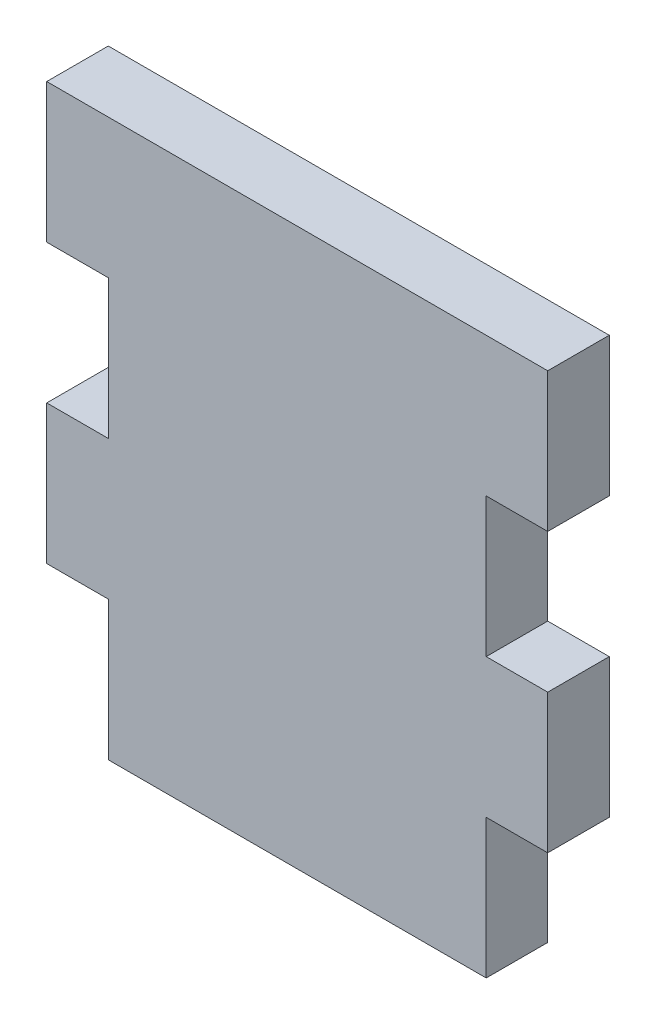
ISO-10303-21;
HEADER;
FILE_DESCRIPTION(('STEP AP214'),'2;1');
FILE_NAME('part.step','',(''),(''),'','','');
FILE_SCHEMA(('AUTOMOTIVE_DESIGN { 1 0 10303 214 1 1 1 1 }'));
ENDSEC;
DATA;
#1=APPLICATION_CONTEXT('core data for automotive mechanical design processes');
#2=APPLICATION_PROTOCOL_DEFINITION('international standard','automotive_design',2000,#1);
#3=PRODUCT_CONTEXT('',#1,'mechanical');
#4=PRODUCT('Part','Part','',(#3));
#5=PRODUCT_RELATED_PRODUCT_CATEGORY('part','',(#4));
#6=PRODUCT_DEFINITION_FORMATION('','',#4);
#7=PRODUCT_DEFINITION_CONTEXT('part definition',#1,'design');
#8=PRODUCT_DEFINITION('design','',#6,#7);
#9=PRODUCT_DEFINITION_SHAPE('','',#8);
#10=(LENGTH_UNIT() NAMED_UNIT(*) SI_UNIT(.MILLI.,.METRE.));
#11=(NAMED_UNIT(*) PLANE_ANGLE_UNIT() SI_UNIT($,.RADIAN.));
#12=(NAMED_UNIT(*) SI_UNIT($,.STERADIAN.) SOLID_ANGLE_UNIT());
#13=UNCERTAINTY_MEASURE_WITH_UNIT(LENGTH_MEASURE(1.E-05),#10,'distance_accuracy_value','');
#14=(GEOMETRIC_REPRESENTATION_CONTEXT(3) GLOBAL_UNCERTAINTY_ASSIGNED_CONTEXT((#13)) GLOBAL_UNIT_ASSIGNED_CONTEXT((#10,
#11,#12)) REPRESENTATION_CONTEXT('',''));
#15=CARTESIAN_POINT('',(0.,0.,0.));
#16=DIRECTION('',(0.,0.,1.));
#17=DIRECTION('',(1.,0.,0.));
#18=AXIS2_PLACEMENT_3D('',#15,#16,#17);
#19=CARTESIAN_POINT('',(-44.6512493245253,14.1108572179902,5.334));
#20=DIRECTION('',(-1.,0.,0.));
#21=DIRECTION('',(0.,-1.,0.));
#22=AXIS2_PLACEMENT_3D('',#19,#20,#21);
#23=PLANE('',#22);
#24=DIRECTION('',(0.,1.,0.));
#25=VECTOR('',#24,1.);
#26=CARTESIAN_POINT('',(-44.6512493245253,14.1108572179902,5.334));
#27=LINE('',#26,#25);
#28=CARTESIAN_POINT('',(-44.6512493245253,-22.0841427820098,5.334));
#29=VERTEX_POINT('',#28);
#30=CARTESIAN_POINT('',(-44.6512493245253,-10.0191427820098,5.334));
#31=VERTEX_POINT('',#30);
#32=EDGE_CURVE('E253',#29,#31,#27,.T.);
#33=ORIENTED_EDGE('',*,*,#32,.F.);
#34=DIRECTION('',(0.,0.,1.));
#35=VECTOR('',#34,1.);
#36=CARTESIAN_POINT('',(-44.6512493245253,-22.0841427820098,0.));
#37=LINE('',#36,#35);
#38=CARTESIAN_POINT('',(-44.6512493245253,-22.0841427820098,0.));
#39=VERTEX_POINT('',#38);
#40=EDGE_CURVE('E172',#39,#29,#37,.T.);
#41=ORIENTED_EDGE('',*,*,#40,.F.);
#42=DIRECTION('',(0.,1.,0.));
#43=VECTOR('',#42,1.);
#44=CARTESIAN_POINT('',(-44.6512493245253,14.1108572179902,0.));
#45=LINE('',#44,#43);
#46=CARTESIAN_POINT('',(-44.6512493245253,-10.0191427820098,0.));
#47=VERTEX_POINT('',#46);
#48=EDGE_CURVE('E166',#39,#47,#45,.T.);
#49=ORIENTED_EDGE('',*,*,#48,.T.);
#50=DIRECTION('',(0.,0.,1.));
#51=VECTOR('',#50,1.);
#52=CARTESIAN_POINT('',(-44.6512493245253,-10.0191427820098,0.));
#53=LINE('',#52,#51);
#54=EDGE_CURVE('E183',#47,#31,#53,.T.);
#55=ORIENTED_EDGE('',*,*,#54,.T.);
#56=EDGE_LOOP('',(#33,#41,#49,#55));
#57=FACE_BOUND('',#56,.T.);
#58=ADVANCED_FACE('F35',(#57),#23,.F.);
#59=CARTESIAN_POINT('',(-88.0852493245253,14.1108572179902,5.334));
#60=DIRECTION('',(1.,0.,0.));
#61=DIRECTION('',(0.,0.,-1.));
#62=AXIS2_PLACEMENT_3D('',#59,#60,#61);
#63=PLANE('',#62);
#64=DIRECTION('',(0.,-1.,0.));
#65=VECTOR('',#64,1.);
#66=CARTESIAN_POINT('',(-88.0852493245253,14.1108572179902,0.));
#67=LINE('',#66,#65);
#68=CARTESIAN_POINT('',(-88.0852493245253,14.1108572179902,0.));
#69=VERTEX_POINT('',#68);
#70=CARTESIAN_POINT('',(-88.0852493245253,2.04585721799016,0.));
#71=VERTEX_POINT('',#70);
#72=EDGE_CURVE('E257',#69,#71,#67,.T.);
#73=ORIENTED_EDGE('',*,*,#72,.T.);
#74=DIRECTION('',(0.,0.,1.));
#75=VECTOR('',#74,1.);
#76=CARTESIAN_POINT('',(-88.0852493245253,2.04585721799016,0.));
#77=LINE('',#76,#75);
#78=CARTESIAN_POINT('',(-88.0852493245253,2.04585721799016,5.334));
#79=VERTEX_POINT('',#78);
#80=EDGE_CURVE('E217',#71,#79,#77,.T.);
#81=ORIENTED_EDGE('',*,*,#80,.T.);
#82=DIRECTION('',(0.,-1.,0.));
#83=VECTOR('',#82,1.);
#84=CARTESIAN_POINT('',(-88.0852493245253,14.1108572179902,5.334));
#85=LINE('',#84,#83);
#86=CARTESIAN_POINT('',(-88.0852493245253,14.1108572179902,5.334));
#87=VERTEX_POINT('',#86);
#88=EDGE_CURVE('E245',#87,#79,#85,.T.);
#89=ORIENTED_EDGE('',*,*,#88,.F.);
#90=DIRECTION('',(0.,0.,-1.));
#91=VECTOR('',#90,1.);
#92=CARTESIAN_POINT('',(-88.0852493245253,14.1108572179902,5.334));
#93=LINE('',#92,#91);
#94=EDGE_CURVE('E43',#87,#69,#93,.T.);
#95=ORIENTED_EDGE('',*,*,#94,.T.);
#96=EDGE_LOOP('',(#73,#81,#89,#95));
#97=FACE_BOUND('',#96,.T.);
#98=ADVANCED_FACE('F270',(#97),#63,.F.);
#99=CARTESIAN_POINT('',(-88.0852493245253,-10.0191427820098,5.334));
#100=VERTEX_POINT('',#99);
#101=CARTESIAN_POINT('',(-88.0852493245253,-22.0841427820098,5.334));
#102=VERTEX_POINT('',#101);
#103=EDGE_CURVE('E249',#100,#102,#85,.T.);
#104=ORIENTED_EDGE('',*,*,#103,.F.);
#105=DIRECTION('',(0.,0.,1.));
#106=VECTOR('',#105,1.);
#107=CARTESIAN_POINT('',(-88.0852493245253,-10.0191427820098,0.));
#108=LINE('',#107,#106);
#109=CARTESIAN_POINT('',(-88.0852493245253,-10.0191427820098,0.));
#110=VERTEX_POINT('',#109);
#111=EDGE_CURVE('E210',#110,#100,#108,.T.);
#112=ORIENTED_EDGE('',*,*,#111,.F.);
#113=CARTESIAN_POINT('',(-88.0852493245253,-22.0841427820098,0.));
#114=VERTEX_POINT('',#113);
#115=EDGE_CURVE('E241',#110,#114,#67,.T.);
#116=ORIENTED_EDGE('',*,*,#115,.T.);
#117=DIRECTION('',(0.,0.,1.));
#118=VECTOR('',#117,1.);
#119=CARTESIAN_POINT('',(-88.0852493245253,-22.0841427820098,0.));
#120=LINE('',#119,#118);
#121=EDGE_CURVE('E238',#114,#102,#120,.T.);
#122=ORIENTED_EDGE('',*,*,#121,.T.);
#123=EDGE_LOOP('',(#104,#112,#116,#122));
#124=FACE_BOUND('',#123,.T.);
#125=ADVANCED_FACE('F37',(#124),#63,.F.);
#126=CARTESIAN_POINT('',(-88.0852493245253,-34.1491427820098,5.334));
#127=DIRECTION('',(0.,1.,0.));
#128=DIRECTION('',(0.,0.,1.));
#129=AXIS2_PLACEMENT_3D('',#126,#127,#128);
#130=PLANE('',#129);
#131=DIRECTION('',(1.,0.,0.));
#132=VECTOR('',#131,1.);
#133=CARTESIAN_POINT('',(-88.0852493245253,-34.1491427820098,0.));
#134=LINE('',#133,#132);
#135=CARTESIAN_POINT('',(-82.7512493245252,-34.1491427820098,0.));
#136=VERTEX_POINT('',#135);
#137=CARTESIAN_POINT('',(-49.9852493245253,-34.1491427820098,0.));
#138=VERTEX_POINT('',#137);
#139=EDGE_CURVE('E260',#136,#138,#134,.T.);
#140=ORIENTED_EDGE('',*,*,#139,.T.);
#141=DIRECTION('',(0.,0.,1.));
#142=VECTOR('',#141,1.);
#143=CARTESIAN_POINT('',(-49.9852493245252,-34.1491427820098,0.));
#144=LINE('',#143,#142);
#145=CARTESIAN_POINT('',(-49.9852493245252,-34.1491427820098,5.334));
#146=VERTEX_POINT('',#145);
#147=EDGE_CURVE('E50',#138,#146,#144,.T.);
#148=ORIENTED_EDGE('',*,*,#147,.T.);
#149=DIRECTION('',(1.,0.,0.));
#150=VECTOR('',#149,1.);
#151=CARTESIAN_POINT('',(-88.0852493245253,-34.1491427820098,5.334));
#152=LINE('',#151,#150);
#153=CARTESIAN_POINT('',(-82.7512493245252,-34.1491427820098,5.334));
#154=VERTEX_POINT('',#153);
#155=EDGE_CURVE('E248',#154,#146,#152,.T.);
#156=ORIENTED_EDGE('',*,*,#155,.F.);
#157=DIRECTION('',(0.,0.,1.));
#158=VECTOR('',#157,1.);
#159=CARTESIAN_POINT('',(-82.7512493245252,-34.1491427820098,0.));
#160=LINE('',#159,#158);
#161=EDGE_CURVE('E233',#136,#154,#160,.T.);
#162=ORIENTED_EDGE('',*,*,#161,.F.);
#163=EDGE_LOOP('',(#140,#148,#156,#162));
#164=FACE_BOUND('',#163,.T.);
#165=ADVANCED_FACE('F303',(#164),#130,.F.);
#166=CARTESIAN_POINT('',(-44.6512493245253,2.04585721799016,5.334));
#167=VERTEX_POINT('',#166);
#168=CARTESIAN_POINT('',(-44.6512493245253,14.1108572179902,5.334));
#169=VERTEX_POINT('',#168);
#170=EDGE_CURVE('E252',#167,#169,#27,.T.);
#171=ORIENTED_EDGE('',*,*,#170,.F.);
#172=DIRECTION('',(0.,0.,1.));
#173=VECTOR('',#172,1.);
#174=CARTESIAN_POINT('',(-44.6512493245253,2.04585721799016,0.));
#175=LINE('',#174,#173);
#176=CARTESIAN_POINT('',(-44.6512493245253,2.04585721799016,0.));
#177=VERTEX_POINT('',#176);
#178=EDGE_CURVE('E196',#177,#167,#175,.T.);
#179=ORIENTED_EDGE('',*,*,#178,.F.);
#180=CARTESIAN_POINT('',(-44.6512493245253,14.1108572179902,0.));
#181=VERTEX_POINT('',#180);
#182=EDGE_CURVE('E262',#177,#181,#45,.T.);
#183=ORIENTED_EDGE('',*,*,#182,.T.);
#184=DIRECTION('',(0.,0.,-1.));
#185=VECTOR('',#184,1.);
#186=CARTESIAN_POINT('',(-44.6512493245253,14.1108572179902,5.334));
#187=LINE('',#186,#185);
#188=EDGE_CURVE('E11',#169,#181,#187,.T.);
#189=ORIENTED_EDGE('',*,*,#188,.F.);
#190=EDGE_LOOP('',(#171,#179,#183,#189));
#191=FACE_BOUND('',#190,.T.);
#192=ADVANCED_FACE('F287',(#191),#23,.F.);
#193=CARTESIAN_POINT('',(-88.0852493245253,14.1108572179902,5.334));
#194=DIRECTION('',(0.,-1.,0.));
#195=DIRECTION('',(0.,0.,-1.));
#196=AXIS2_PLACEMENT_3D('',#193,#194,#195);
#197=PLANE('',#196);
#198=DIRECTION('',(-1.,0.,0.));
#199=VECTOR('',#198,1.);
#200=CARTESIAN_POINT('',(-88.0852493245253,14.1108572179902,0.));
#201=LINE('',#200,#199);
#202=EDGE_CURVE('E264',#181,#69,#201,.T.);
#203=ORIENTED_EDGE('',*,*,#202,.T.);
#204=ORIENTED_EDGE('',*,*,#94,.F.);
#205=DIRECTION('',(-1.,0.,0.));
#206=VECTOR('',#205,1.);
#207=CARTESIAN_POINT('',(-88.0852493245253,14.1108572179902,5.334));
#208=LINE('',#207,#206);
#209=EDGE_CURVE('E255',#169,#87,#208,.T.);
#210=ORIENTED_EDGE('',*,*,#209,.F.);
#211=ORIENTED_EDGE('',*,*,#188,.T.);
#212=EDGE_LOOP('',(#203,#204,#210,#211));
#213=FACE_BOUND('',#212,.T.);
#214=ADVANCED_FACE('F285',(#213),#197,.F.);
#215=CARTESIAN_POINT('',(0.,0.,5.334));
#216=DIRECTION('',(0.,0.,1.));
#217=DIRECTION('',(1.,0.,0.));
#218=AXIS2_PLACEMENT_3D('',#215,#216,#217);
#219=PLANE('',#218);
#220=DIRECTION('',(-1.,0.,0.));
#221=VECTOR('',#220,1.);
#222=CARTESIAN_POINT('',(-44.6512493245253,-22.0841427820098,5.334));
#223=LINE('',#222,#221);
#224=CARTESIAN_POINT('',(-49.9852493245253,-22.0841427820098,5.334));
#225=VERTEX_POINT('',#224);
#226=EDGE_CURVE('E154',#29,#225,#223,.T.);
#227=ORIENTED_EDGE('',*,*,#226,.F.);
#228=ORIENTED_EDGE('',*,*,#32,.T.);
#229=DIRECTION('',(1.,0.,0.));
#230=VECTOR('',#229,1.);
#231=CARTESIAN_POINT('',(-44.6512493245253,-10.0191427820098,5.334));
#232=LINE('',#231,#230);
#233=CARTESIAN_POINT('',(-49.9852493245253,-10.0191427820098,5.334));
#234=VERTEX_POINT('',#233);
#235=EDGE_CURVE('E174',#234,#31,#232,.T.);
#236=ORIENTED_EDGE('',*,*,#235,.F.);
#237=DIRECTION('',(0.,-1.,0.));
#238=VECTOR('',#237,1.);
#239=CARTESIAN_POINT('',(-49.9852493245253,-10.0191427820098,5.334));
#240=LINE('',#239,#238);
#241=CARTESIAN_POINT('',(-49.9852493245253,2.04585721799016,5.334));
#242=VERTEX_POINT('',#241);
#243=EDGE_CURVE('E179',#242,#234,#240,.T.);
#244=ORIENTED_EDGE('',*,*,#243,.F.);
#245=DIRECTION('',(-1.,0.,0.));
#246=VECTOR('',#245,1.);
#247=CARTESIAN_POINT('',(-44.6512493245253,2.04585721799016,5.334));
#248=LINE('',#247,#246);
#249=EDGE_CURVE('E186',#167,#242,#248,.T.);
#250=ORIENTED_EDGE('',*,*,#249,.F.);
#251=ORIENTED_EDGE('',*,*,#170,.T.);
#252=ORIENTED_EDGE('',*,*,#209,.T.);
#253=ORIENTED_EDGE('',*,*,#88,.T.);
#254=DIRECTION('',(-1.,0.,0.));
#255=VECTOR('',#254,1.);
#256=CARTESIAN_POINT('',(-88.0852493245253,2.04585721799016,5.334));
#257=LINE('',#256,#255);
#258=CARTESIAN_POINT('',(-82.7512493245252,2.04585721799016,5.334));
#259=VERTEX_POINT('',#258);
#260=EDGE_CURVE('E204',#259,#79,#257,.T.);
#261=ORIENTED_EDGE('',*,*,#260,.F.);
#262=DIRECTION('',(0.,1.,0.));
#263=VECTOR('',#262,1.);
#264=CARTESIAN_POINT('',(-82.7512493245252,-10.0191427820098,5.334));
#265=LINE('',#264,#263);
#266=CARTESIAN_POINT('',(-82.7512493245252,-10.0191427820098,5.334));
#267=VERTEX_POINT('',#266);
#268=EDGE_CURVE('E213',#267,#259,#265,.T.);
#269=ORIENTED_EDGE('',*,*,#268,.F.);
#270=DIRECTION('',(1.,0.,0.));
#271=VECTOR('',#270,1.);
#272=CARTESIAN_POINT('',(-88.0852493245253,-10.0191427820098,5.334));
#273=LINE('',#272,#271);
#274=EDGE_CURVE('E193',#100,#267,#273,.T.);
#275=ORIENTED_EDGE('',*,*,#274,.F.);
#276=ORIENTED_EDGE('',*,*,#103,.T.);
#277=DIRECTION('',(-1.,0.,0.));
#278=VECTOR('',#277,1.);
#279=CARTESIAN_POINT('',(-88.0852493245253,-22.0841427820098,5.334));
#280=LINE('',#279,#278);
#281=CARTESIAN_POINT('',(-82.7512493245252,-22.0841427820098,5.334));
#282=VERTEX_POINT('',#281);
#283=EDGE_CURVE('E230',#282,#102,#280,.T.);
#284=ORIENTED_EDGE('',*,*,#283,.F.);
#285=DIRECTION('',(0.,1.,0.));
#286=VECTOR('',#285,1.);
#287=CARTESIAN_POINT('',(-82.7512493245252,-34.1491427820098,5.334));
#288=LINE('',#287,#286);
#289=EDGE_CURVE('E220',#154,#282,#288,.T.);
#290=ORIENTED_EDGE('',*,*,#289,.F.);
#291=ORIENTED_EDGE('',*,*,#155,.T.);
#292=DIRECTION('',(0.,-1.,0.));
#293=VECTOR('',#292,1.);
#294=CARTESIAN_POINT('',(-49.9852493245252,-34.1491427820098,5.334));
#295=LINE('',#294,#293);
#296=EDGE_CURVE('E167',#225,#146,#295,.T.);
#297=ORIENTED_EDGE('',*,*,#296,.F.);
#298=EDGE_LOOP('',(#227,#228,#236,#244,#250,#251,#252,#253,#261,#269,#275,#276,#284,#290,#291,#297));
#299=FACE_BOUND('',#298,.T.);
#300=ADVANCED_FACE('F280',(#299),#219,.T.);
#301=CARTESIAN_POINT('',(0.,0.,0.));
#302=DIRECTION('',(0.,0.,1.));
#303=DIRECTION('',(1.,0.,0.));
#304=AXIS2_PLACEMENT_3D('',#301,#302,#303);
#305=PLANE('',#304);
#306=ORIENTED_EDGE('',*,*,#48,.F.);
#307=DIRECTION('',(-1.,0.,0.));
#308=VECTOR('',#307,1.);
#309=CARTESIAN_POINT('',(-44.6512493245253,-22.0841427820098,0.));
#310=LINE('',#309,#308);
#311=CARTESIAN_POINT('',(-49.9852493245253,-22.0841427820098,0.));
#312=VERTEX_POINT('',#311);
#313=EDGE_CURVE('E151',#39,#312,#310,.T.);
#314=ORIENTED_EDGE('',*,*,#313,.T.);
#315=DIRECTION('',(0.,-1.,0.));
#316=VECTOR('',#315,1.);
#317=CARTESIAN_POINT('',(-49.9852493245252,-34.1491427820098,0.));
#318=LINE('',#317,#316);
#319=EDGE_CURVE('E156',#312,#138,#318,.T.);
#320=ORIENTED_EDGE('',*,*,#319,.T.);
#321=ORIENTED_EDGE('',*,*,#139,.F.);
#322=DIRECTION('',(0.,1.,0.));
#323=VECTOR('',#322,1.);
#324=CARTESIAN_POINT('',(-82.7512493245252,-34.1491427820098,0.));
#325=LINE('',#324,#323);
#326=CARTESIAN_POINT('',(-82.7512493245252,-22.0841427820098,0.));
#327=VERTEX_POINT('',#326);
#328=EDGE_CURVE('E226',#136,#327,#325,.T.);
#329=ORIENTED_EDGE('',*,*,#328,.T.);
#330=DIRECTION('',(-1.,0.,0.));
#331=VECTOR('',#330,1.);
#332=CARTESIAN_POINT('',(-88.0852493245253,-22.0841427820098,0.));
#333=LINE('',#332,#331);
#334=EDGE_CURVE('E229',#327,#114,#333,.T.);
#335=ORIENTED_EDGE('',*,*,#334,.T.);
#336=ORIENTED_EDGE('',*,*,#115,.F.);
#337=DIRECTION('',(1.,0.,0.));
#338=VECTOR('',#337,1.);
#339=CARTESIAN_POINT('',(-88.0852493245253,-10.0191427820098,0.));
#340=LINE('',#339,#338);
#341=CARTESIAN_POINT('',(-82.7512493245252,-10.0191427820098,0.));
#342=VERTEX_POINT('',#341);
#343=EDGE_CURVE('E200',#110,#342,#340,.T.);
#344=ORIENTED_EDGE('',*,*,#343,.T.);
#345=DIRECTION('',(0.,1.,0.));
#346=VECTOR('',#345,1.);
#347=CARTESIAN_POINT('',(-82.7512493245252,-10.0191427820098,0.));
#348=LINE('',#347,#346);
#349=CARTESIAN_POINT('',(-82.7512493245252,2.04585721799016,0.));
#350=VERTEX_POINT('',#349);
#351=EDGE_CURVE('E203',#342,#350,#348,.T.);
#352=ORIENTED_EDGE('',*,*,#351,.T.);
#353=DIRECTION('',(-1.,0.,0.));
#354=VECTOR('',#353,1.);
#355=CARTESIAN_POINT('',(-88.0852493245253,2.04585721799016,0.));
#356=LINE('',#355,#354);
#357=EDGE_CURVE('E207',#350,#71,#356,.T.);
#358=ORIENTED_EDGE('',*,*,#357,.T.);
#359=ORIENTED_EDGE('',*,*,#72,.F.);
#360=ORIENTED_EDGE('',*,*,#202,.F.);
#361=ORIENTED_EDGE('',*,*,#182,.F.);
#362=DIRECTION('',(-1.,0.,0.));
#363=VECTOR('',#362,1.);
#364=CARTESIAN_POINT('',(-44.6512493245253,2.04585721799016,0.));
#365=LINE('',#364,#363);
#366=CARTESIAN_POINT('',(-49.9852493245253,2.04585721799016,0.));
#367=VERTEX_POINT('',#366);
#368=EDGE_CURVE('E178',#177,#367,#365,.T.);
#369=ORIENTED_EDGE('',*,*,#368,.T.);
#370=DIRECTION('',(0.,-1.,0.));
#371=VECTOR('',#370,1.);
#372=CARTESIAN_POINT('',(-49.9852493245253,-10.0191427820098,0.));
#373=LINE('',#372,#371);
#374=CARTESIAN_POINT('',(-49.9852493245253,-10.0191427820098,0.));
#375=VERTEX_POINT('',#374);
#376=EDGE_CURVE('E58',#367,#375,#373,.T.);
#377=ORIENTED_EDGE('',*,*,#376,.T.);
#378=DIRECTION('',(1.,0.,0.));
#379=VECTOR('',#378,1.);
#380=CARTESIAN_POINT('',(-44.6512493245253,-10.0191427820098,0.));
#381=LINE('',#380,#379);
#382=EDGE_CURVE('E176',#375,#47,#381,.T.);
#383=ORIENTED_EDGE('',*,*,#382,.T.);
#384=EDGE_LOOP('',(#306,#314,#320,#321,#329,#335,#336,#344,#352,#358,#359,#360,#361,#369,#377,#383));
#385=FACE_BOUND('',#384,.T.);
#386=ADVANCED_FACE('F164',(#385),#305,.F.);
#387=CARTESIAN_POINT('',(-88.0852493245253,-22.0841427820098,0.));
#388=DIRECTION('',(0.,1.,0.));
#389=DIRECTION('',(0.,0.,1.));
#390=AXIS2_PLACEMENT_3D('',#387,#388,#389);
#391=PLANE('',#390);
#392=ORIENTED_EDGE('',*,*,#283,.T.);
#393=ORIENTED_EDGE('',*,*,#121,.F.);
#394=ORIENTED_EDGE('',*,*,#334,.F.);
#395=DIRECTION('',(0.,0.,1.));
#396=VECTOR('',#395,1.);
#397=CARTESIAN_POINT('',(-82.7512493245252,-22.0841427820098,0.));
#398=LINE('',#397,#396);
#399=EDGE_CURVE('E242',#327,#282,#398,.T.);
#400=ORIENTED_EDGE('',*,*,#399,.T.);
#401=EDGE_LOOP('',(#392,#393,#394,#400));
#402=FACE_BOUND('',#401,.T.);
#403=ADVANCED_FACE('F311',(#402),#391,.F.);
#404=CARTESIAN_POINT('',(-82.7512493245252,-34.1491427820098,0.));
#405=DIRECTION('',(1.,0.,0.));
#406=DIRECTION('',(0.,0.,-1.));
#407=AXIS2_PLACEMENT_3D('',#404,#405,#406);
#408=PLANE('',#407);
#409=ORIENTED_EDGE('',*,*,#289,.T.);
#410=ORIENTED_EDGE('',*,*,#399,.F.);
#411=ORIENTED_EDGE('',*,*,#328,.F.);
#412=ORIENTED_EDGE('',*,*,#161,.T.);
#413=EDGE_LOOP('',(#409,#410,#411,#412));
#414=FACE_BOUND('',#413,.T.);
#415=ADVANCED_FACE('F308',(#414),#408,.F.);
#416=CARTESIAN_POINT('',(-88.0852493245253,2.04585721799016,0.));
#417=DIRECTION('',(0.,1.,0.));
#418=DIRECTION('',(-1.,0.,0.));
#419=AXIS2_PLACEMENT_3D('',#416,#417,#418);
#420=PLANE('',#419);
#421=ORIENTED_EDGE('',*,*,#260,.T.);
#422=ORIENTED_EDGE('',*,*,#80,.F.);
#423=ORIENTED_EDGE('',*,*,#357,.F.);
#424=DIRECTION('',(0.,0.,1.));
#425=VECTOR('',#424,1.);
#426=CARTESIAN_POINT('',(-82.7512493245252,2.04585721799016,0.));
#427=LINE('',#426,#425);
#428=EDGE_CURVE('E221',#350,#259,#427,.T.);
#429=ORIENTED_EDGE('',*,*,#428,.T.);
#430=EDGE_LOOP('',(#421,#422,#423,#429));
#431=FACE_BOUND('',#430,.T.);
#432=ADVANCED_FACE('F277',(#431),#420,.F.);
#433=CARTESIAN_POINT('',(-82.7512493245252,-10.0191427820098,0.));
#434=DIRECTION('',(1.,0.,0.));
#435=DIRECTION('',(0.,0.,-1.));
#436=AXIS2_PLACEMENT_3D('',#433,#434,#435);
#437=PLANE('',#436);
#438=ORIENTED_EDGE('',*,*,#268,.T.);
#439=ORIENTED_EDGE('',*,*,#428,.F.);
#440=ORIENTED_EDGE('',*,*,#351,.F.);
#441=DIRECTION('',(0.,0.,1.));
#442=VECTOR('',#441,1.);
#443=CARTESIAN_POINT('',(-82.7512493245252,-10.0191427820098,0.));
#444=LINE('',#443,#442);
#445=EDGE_CURVE('E223',#342,#267,#444,.T.);
#446=ORIENTED_EDGE('',*,*,#445,.T.);
#447=EDGE_LOOP('',(#438,#439,#440,#446));
#448=FACE_BOUND('',#447,.T.);
#449=ADVANCED_FACE('F321',(#448),#437,.F.);
#450=CARTESIAN_POINT('',(-88.0852493245253,-10.0191427820098,0.));
#451=DIRECTION('',(0.,-1.,0.));
#452=DIRECTION('',(1.,0.,0.));
#453=AXIS2_PLACEMENT_3D('',#450,#451,#452);
#454=PLANE('',#453);
#455=ORIENTED_EDGE('',*,*,#274,.T.);
#456=ORIENTED_EDGE('',*,*,#445,.F.);
#457=ORIENTED_EDGE('',*,*,#343,.F.);
#458=ORIENTED_EDGE('',*,*,#111,.T.);
#459=EDGE_LOOP('',(#455,#456,#457,#458));
#460=FACE_BOUND('',#459,.T.);
#461=ADVANCED_FACE('F318',(#460),#454,.F.);
#462=CARTESIAN_POINT('',(-44.6512493245253,-10.0191427820098,0.));
#463=DIRECTION('',(0.,-1.,0.));
#464=DIRECTION('',(1.,0.,0.));
#465=AXIS2_PLACEMENT_3D('',#462,#463,#464);
#466=PLANE('',#465);
#467=ORIENTED_EDGE('',*,*,#235,.T.);
#468=ORIENTED_EDGE('',*,*,#54,.F.);
#469=ORIENTED_EDGE('',*,*,#382,.F.);
#470=DIRECTION('',(0.,0.,1.));
#471=VECTOR('',#470,1.);
#472=CARTESIAN_POINT('',(-49.9852493245253,-10.0191427820098,0.));
#473=LINE('',#472,#471);
#474=EDGE_CURVE('E191',#375,#234,#473,.T.);
#475=ORIENTED_EDGE('',*,*,#474,.T.);
#476=EDGE_LOOP('',(#467,#468,#469,#475));
#477=FACE_BOUND('',#476,.T.);
#478=ADVANCED_FACE('F298',(#477),#466,.F.);
#479=CARTESIAN_POINT('',(-49.9852493245253,-10.0191427820098,0.));
#480=DIRECTION('',(-1.,0.,0.));
#481=DIRECTION('',(0.,-1.,0.));
#482=AXIS2_PLACEMENT_3D('',#479,#480,#481);
#483=PLANE('',#482);
#484=ORIENTED_EDGE('',*,*,#243,.T.);
#485=ORIENTED_EDGE('',*,*,#474,.F.);
#486=ORIENTED_EDGE('',*,*,#376,.F.);
#487=DIRECTION('',(0.,0.,1.));
#488=VECTOR('',#487,1.);
#489=CARTESIAN_POINT('',(-49.9852493245253,2.04585721799016,0.));
#490=LINE('',#489,#488);
#491=EDGE_CURVE('E194',#367,#242,#490,.T.);
#492=ORIENTED_EDGE('',*,*,#491,.T.);
#493=EDGE_LOOP('',(#484,#485,#486,#492));
#494=FACE_BOUND('',#493,.T.);
#495=ADVANCED_FACE('F292',(#494),#483,.F.);
#496=CARTESIAN_POINT('',(-44.6512493245253,2.04585721799016,0.));
#497=DIRECTION('',(0.,1.,0.));
#498=DIRECTION('',(-1.,0.,0.));
#499=AXIS2_PLACEMENT_3D('',#496,#497,#498);
#500=PLANE('',#499);
#501=ORIENTED_EDGE('',*,*,#249,.T.);
#502=ORIENTED_EDGE('',*,*,#491,.F.);
#503=ORIENTED_EDGE('',*,*,#368,.F.);
#504=ORIENTED_EDGE('',*,*,#178,.T.);
#505=EDGE_LOOP('',(#501,#502,#503,#504));
#506=FACE_BOUND('',#505,.T.);
#507=ADVANCED_FACE('F290',(#506),#500,.F.);
#508=CARTESIAN_POINT('',(-44.6512493245253,-22.0841427820098,0.));
#509=DIRECTION('',(0.,1.,0.));
#510=DIRECTION('',(-1.,0.,0.));
#511=AXIS2_PLACEMENT_3D('',#508,#509,#510);
#512=PLANE('',#511);
#513=ORIENTED_EDGE('',*,*,#226,.T.);
#514=DIRECTION('',(0.,0.,1.));
#515=VECTOR('',#514,1.);
#516=CARTESIAN_POINT('',(-49.9852493245253,-22.0841427820098,0.));
#517=LINE('',#516,#515);
#518=EDGE_CURVE('E148',#312,#225,#517,.T.);
#519=ORIENTED_EDGE('',*,*,#518,.F.);
#520=ORIENTED_EDGE('',*,*,#313,.F.);
#521=ORIENTED_EDGE('',*,*,#40,.T.);
#522=EDGE_LOOP('',(#513,#519,#520,#521));
#523=FACE_BOUND('',#522,.T.);
#524=ADVANCED_FACE('F149',(#523),#512,.F.);
#525=CARTESIAN_POINT('',(-49.9852493245252,-34.1491427820098,0.));
#526=DIRECTION('',(-1.,0.,0.));
#527=DIRECTION('',(0.,-1.,0.));
#528=AXIS2_PLACEMENT_3D('',#525,#526,#527);
#529=PLANE('',#528);
#530=ORIENTED_EDGE('',*,*,#296,.T.);
#531=ORIENTED_EDGE('',*,*,#147,.F.);
#532=ORIENTED_EDGE('',*,*,#319,.F.);
#533=ORIENTED_EDGE('',*,*,#518,.T.);
#534=EDGE_LOOP('',(#530,#531,#532,#533));
#535=FACE_BOUND('',#534,.T.);
#536=ADVANCED_FACE('F158',(#535),#529,.F.);
#537=CLOSED_SHELL('',(#58,#98,#125,#165,#192,#214,#300,#386,#403,#415,#432,#449,#461,#478,#495,
#507,#524,#536));
#538=MANIFOLD_SOLID_BREP('B2',#537);
#539=ADVANCED_BREP_SHAPE_REPRESENTATION('',(#18,#538),#14);
#540=SHAPE_DEFINITION_REPRESENTATION(#9,#539);
ENDSEC;
END-ISO-10303-21;
